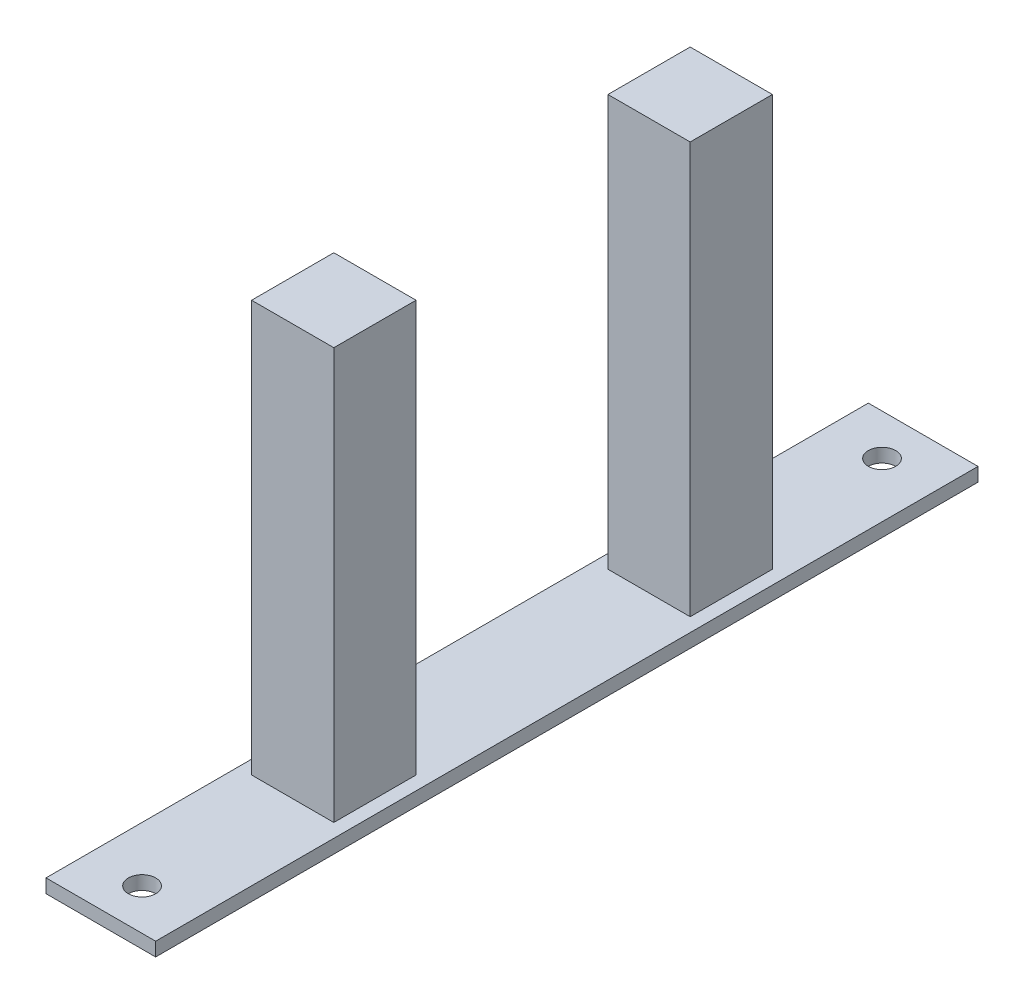
ISO-10303-21;
HEADER;
FILE_DESCRIPTION(('STEP AP214'),'2;1');
FILE_NAME('part.step','',(''),(''),'','','');
FILE_SCHEMA(('AUTOMOTIVE_DESIGN { 1 0 10303 214 1 1 1 1 }'));
ENDSEC;
DATA;
#1=APPLICATION_CONTEXT('core data for automotive mechanical design processes');
#2=APPLICATION_PROTOCOL_DEFINITION('international standard','automotive_design',2000,#1);
#3=PRODUCT_CONTEXT('',#1,'mechanical');
#4=PRODUCT('Part','Part','',(#3));
#5=PRODUCT_RELATED_PRODUCT_CATEGORY('part','',(#4));
#6=PRODUCT_DEFINITION_FORMATION('','',#4);
#7=PRODUCT_DEFINITION_CONTEXT('part definition',#1,'design');
#8=PRODUCT_DEFINITION('design','',#6,#7);
#9=PRODUCT_DEFINITION_SHAPE('','',#8);
#10=(LENGTH_UNIT() NAMED_UNIT(*) SI_UNIT(.MILLI.,.METRE.));
#11=(NAMED_UNIT(*) PLANE_ANGLE_UNIT() SI_UNIT($,.RADIAN.));
#12=(NAMED_UNIT(*) SI_UNIT($,.STERADIAN.) SOLID_ANGLE_UNIT());
#13=UNCERTAINTY_MEASURE_WITH_UNIT(LENGTH_MEASURE(1.E-05),#10,'distance_accuracy_value','');
#14=(GEOMETRIC_REPRESENTATION_CONTEXT(3) GLOBAL_UNCERTAINTY_ASSIGNED_CONTEXT((#13)) GLOBAL_UNIT_ASSIGNED_CONTEXT((#10,
#11,#12)) REPRESENTATION_CONTEXT('',''));
#15=CARTESIAN_POINT('',(0.,0.,0.));
#16=DIRECTION('',(0.,0.,1.));
#17=DIRECTION('',(1.,0.,0.));
#18=AXIS2_PLACEMENT_3D('',#15,#16,#17);
#19=CARTESIAN_POINT('',(0.,4.99999999999999,0.));
#20=DIRECTION('',(0.,1.,0.));
#21=DIRECTION('',(0.,0.,1.));
#22=AXIS2_PLACEMENT_3D('',#19,#20,#21);
#23=PLANE('',#22);
#24=CARTESIAN_POINT('',(0.0361864276667359,4.99999999999999,135.));
#25=DIRECTION('',(0.,1.,0.));
#26=DIRECTION('',(0.,0.,1.));
#27=AXIS2_PLACEMENT_3D('',#24,#25,#26);
#28=CIRCLE('',#27,5.);
#29=CARTESIAN_POINT('',(0.0361864276667359,4.99999999999999,140.));
#30=VERTEX_POINT('',#29);
#31=EDGE_CURVE('E437',#30,#30,#28,.T.);
#32=ORIENTED_EDGE('',*,*,#31,.F.);
#33=EDGE_LOOP('',(#32));
#34=FACE_BOUND('',#33,.T.);
#35=CARTESIAN_POINT('',(-0.0227474622545576,4.99999999999999,-135.));
#36=DIRECTION('',(0.,1.,0.));
#37=DIRECTION('',(0.,0.,1.));
#38=AXIS2_PLACEMENT_3D('',#35,#36,#37);
#39=CIRCLE('',#38,5.);
#40=CARTESIAN_POINT('',(-0.0227474622545576,4.99999999999999,-130.));
#41=VERTEX_POINT('',#40);
#42=EDGE_CURVE('E439',#41,#41,#39,.T.);
#43=ORIENTED_EDGE('',*,*,#42,.F.);
#44=EDGE_LOOP('',(#43));
#45=FACE_BOUND('',#44,.T.);
#46=DIRECTION('',(0.,0.,-1.));
#47=VECTOR('',#46,1.);
#48=CARTESIAN_POINT('',(20.,4.99999999999999,-150.));
#49=LINE('',#48,#47);
#50=CARTESIAN_POINT('',(20.,4.99999999999999,150.));
#51=VERTEX_POINT('',#50);
#52=CARTESIAN_POINT('',(20.,4.99999999999999,-150.));
#53=VERTEX_POINT('',#52);
#54=EDGE_CURVE('E187',#51,#53,#49,.T.);
#55=ORIENTED_EDGE('',*,*,#54,.T.);
#56=DIRECTION('',(-1.,0.,0.));
#57=VECTOR('',#56,1.);
#58=CARTESIAN_POINT('',(-20.,4.99999999999999,-150.));
#59=LINE('',#58,#57);
#60=CARTESIAN_POINT('',(-20.,4.99999999999999,-150.));
#61=VERTEX_POINT('',#60);
#62=EDGE_CURVE('E190',#53,#61,#59,.T.);
#63=ORIENTED_EDGE('',*,*,#62,.T.);
#64=DIRECTION('',(0.,0.,1.));
#65=VECTOR('',#64,1.);
#66=CARTESIAN_POINT('',(-20.,4.99999999999999,-150.));
#67=LINE('',#66,#65);
#68=CARTESIAN_POINT('',(-20.,4.99999999999999,150.));
#69=VERTEX_POINT('',#68);
#70=EDGE_CURVE('E193',#61,#69,#67,.T.);
#71=ORIENTED_EDGE('',*,*,#70,.T.);
#72=DIRECTION('',(1.,0.,0.));
#73=VECTOR('',#72,1.);
#74=CARTESIAN_POINT('',(-20.,4.99999999999999,150.));
#75=LINE('',#74,#73);
#76=EDGE_CURVE('E195',#69,#51,#75,.T.);
#77=ORIENTED_EDGE('',*,*,#76,.T.);
#78=EDGE_LOOP('',(#55,#63,#71,#77));
#79=FACE_BOUND('',#78,.T.);
#80=DIRECTION('',(-1.,0.,0.));
#81=VECTOR('',#80,1.);
#82=CARTESIAN_POINT('',(-15.,4.99999999999999,-80.));
#83=LINE('',#82,#81);
#84=CARTESIAN_POINT('',(15.,4.99999999999999,-80.));
#85=VERTEX_POINT('',#84);
#86=CARTESIAN_POINT('',(-15.,4.99999999999999,-80.));
#87=VERTEX_POINT('',#86);
#88=EDGE_CURVE('E152',#85,#87,#83,.T.);
#89=ORIENTED_EDGE('',*,*,#88,.F.);
#90=DIRECTION('',(0.,0.,-1.));
#91=VECTOR('',#90,1.);
#92=CARTESIAN_POINT('',(15.,4.99999999999999,-80.));
#93=LINE('',#92,#91);
#94=CARTESIAN_POINT('',(15.,4.99999999999999,-50.));
#95=VERTEX_POINT('',#94);
#96=EDGE_CURVE('E149',#95,#85,#93,.T.);
#97=ORIENTED_EDGE('',*,*,#96,.F.);
#98=DIRECTION('',(1.,0.,0.));
#99=VECTOR('',#98,1.);
#100=CARTESIAN_POINT('',(-15.,4.99999999999999,-50.));
#101=LINE('',#100,#99);
#102=CARTESIAN_POINT('',(-15.,4.99999999999999,-50.));
#103=VERTEX_POINT('',#102);
#104=EDGE_CURVE('E167',#103,#95,#101,.T.);
#105=ORIENTED_EDGE('',*,*,#104,.F.);
#106=DIRECTION('',(0.,0.,1.));
#107=VECTOR('',#106,1.);
#108=CARTESIAN_POINT('',(-15.,4.99999999999999,-80.));
#109=LINE('',#108,#107);
#110=EDGE_CURVE('E175',#87,#103,#109,.T.);
#111=ORIENTED_EDGE('',*,*,#110,.F.);
#112=EDGE_LOOP('',(#89,#97,#105,#111));
#113=FACE_BOUND('',#112,.T.);
#114=DIRECTION('',(-1.,0.,0.));
#115=VECTOR('',#114,1.);
#116=CARTESIAN_POINT('',(-15.,4.99999999999999,50.));
#117=LINE('',#116,#115);
#118=CARTESIAN_POINT('',(15.,4.99999999999999,49.9999999999999));
#119=VERTEX_POINT('',#118);
#120=CARTESIAN_POINT('',(-15.,4.99999999999999,50.));
#121=VERTEX_POINT('',#120);
#122=EDGE_CURVE('E148',#119,#121,#117,.T.);
#123=ORIENTED_EDGE('',*,*,#122,.F.);
#124=DIRECTION('',(0.,0.,-1.));
#125=VECTOR('',#124,1.);
#126=CARTESIAN_POINT('',(15.,4.99999999999999,49.9999999999999));
#127=LINE('',#126,#125);
#128=CARTESIAN_POINT('',(15.,4.99999999999999,80.));
#129=VERTEX_POINT('',#128);
#130=EDGE_CURVE('E143',#129,#119,#127,.T.);
#131=ORIENTED_EDGE('',*,*,#130,.F.);
#132=DIRECTION('',(1.,0.,0.));
#133=VECTOR('',#132,1.);
#134=CARTESIAN_POINT('',(-15.,4.99999999999999,80.));
#135=LINE('',#134,#133);
#136=CARTESIAN_POINT('',(-15.,4.99999999999999,80.));
#137=VERTEX_POINT('',#136);
#138=EDGE_CURVE('E128',#137,#129,#135,.T.);
#139=ORIENTED_EDGE('',*,*,#138,.F.);
#140=DIRECTION('',(0.,0.,1.));
#141=VECTOR('',#140,1.);
#142=CARTESIAN_POINT('',(-15.,4.99999999999999,50.));
#143=LINE('',#142,#141);
#144=EDGE_CURVE('E136',#121,#137,#143,.T.);
#145=ORIENTED_EDGE('',*,*,#144,.F.);
#146=EDGE_LOOP('',(#123,#131,#139,#145));
#147=FACE_BOUND('',#146,.T.);
#148=ADVANCED_FACE('F38',(#34,#45,#79,#113,#147),#23,.T.);
#149=CARTESIAN_POINT('',(20.,4.99999999999999,-150.));
#150=DIRECTION('',(-1.,0.,0.));
#151=DIRECTION('',(0.,0.,1.));
#152=AXIS2_PLACEMENT_3D('',#149,#150,#151);
#153=PLANE('',#152);
#154=DIRECTION('',(0.,0.,-1.));
#155=VECTOR('',#154,1.);
#156=CARTESIAN_POINT('',(20.,0.,-150.));
#157=LINE('',#156,#155);
#158=CARTESIAN_POINT('',(20.,0.,150.));
#159=VERTEX_POINT('',#158);
#160=CARTESIAN_POINT('',(20.,0.,-150.));
#161=VERTEX_POINT('',#160);
#162=EDGE_CURVE('E186',#159,#161,#157,.T.);
#163=ORIENTED_EDGE('',*,*,#162,.T.);
#164=DIRECTION('',(0.,-1.,0.));
#165=VECTOR('',#164,1.);
#166=CARTESIAN_POINT('',(20.,4.99999999999999,-150.));
#167=LINE('',#166,#165);
#168=EDGE_CURVE('E11',#53,#161,#167,.T.);
#169=ORIENTED_EDGE('',*,*,#168,.F.);
#170=ORIENTED_EDGE('',*,*,#54,.F.);
#171=DIRECTION('',(0.,-1.,0.));
#172=VECTOR('',#171,1.);
#173=CARTESIAN_POINT('',(20.,4.99999999999999,150.));
#174=LINE('',#173,#172);
#175=EDGE_CURVE('E197',#51,#159,#174,.T.);
#176=ORIENTED_EDGE('',*,*,#175,.T.);
#177=EDGE_LOOP('',(#163,#169,#170,#176));
#178=FACE_BOUND('',#177,.T.);
#179=ADVANCED_FACE('F40',(#178),#153,.F.);
#180=CARTESIAN_POINT('',(-20.,4.99999999999999,-150.));
#181=DIRECTION('',(0.,0.,1.));
#182=DIRECTION('',(1.,0.,0.));
#183=AXIS2_PLACEMENT_3D('',#180,#181,#182);
#184=PLANE('',#183);
#185=DIRECTION('',(-1.,0.,0.));
#186=VECTOR('',#185,1.);
#187=CARTESIAN_POINT('',(-20.,0.,-150.));
#188=LINE('',#187,#186);
#189=CARTESIAN_POINT('',(-20.,0.,-150.));
#190=VERTEX_POINT('',#189);
#191=EDGE_CURVE('E200',#161,#190,#188,.T.);
#192=ORIENTED_EDGE('',*,*,#191,.T.);
#193=DIRECTION('',(0.,-1.,0.));
#194=VECTOR('',#193,1.);
#195=CARTESIAN_POINT('',(-20.,4.99999999999999,-150.));
#196=LINE('',#195,#194);
#197=EDGE_CURVE('E46',#61,#190,#196,.T.);
#198=ORIENTED_EDGE('',*,*,#197,.F.);
#199=ORIENTED_EDGE('',*,*,#62,.F.);
#200=ORIENTED_EDGE('',*,*,#168,.T.);
#201=EDGE_LOOP('',(#192,#198,#199,#200));
#202=FACE_BOUND('',#201,.T.);
#203=ADVANCED_FACE('F230',(#202),#184,.F.);
#204=CARTESIAN_POINT('',(-20.,4.99999999999999,-150.));
#205=DIRECTION('',(1.,0.,0.));
#206=DIRECTION('',(0.,0.,-1.));
#207=AXIS2_PLACEMENT_3D('',#204,#205,#206);
#208=PLANE('',#207);
#209=DIRECTION('',(0.,0.,1.));
#210=VECTOR('',#209,1.);
#211=CARTESIAN_POINT('',(-20.,0.,-150.));
#212=LINE('',#211,#210);
#213=CARTESIAN_POINT('',(-20.,0.,150.));
#214=VERTEX_POINT('',#213);
#215=EDGE_CURVE('E202',#190,#214,#212,.T.);
#216=ORIENTED_EDGE('',*,*,#215,.T.);
#217=DIRECTION('',(0.,-1.,0.));
#218=VECTOR('',#217,1.);
#219=CARTESIAN_POINT('',(-20.,4.99999999999999,150.));
#220=LINE('',#219,#218);
#221=EDGE_CURVE('E207',#69,#214,#220,.T.);
#222=ORIENTED_EDGE('',*,*,#221,.F.);
#223=ORIENTED_EDGE('',*,*,#70,.F.);
#224=ORIENTED_EDGE('',*,*,#197,.T.);
#225=EDGE_LOOP('',(#216,#222,#223,#224));
#226=FACE_BOUND('',#225,.T.);
#227=ADVANCED_FACE('F214',(#226),#208,.F.);
#228=CARTESIAN_POINT('',(-20.,4.99999999999999,150.));
#229=DIRECTION('',(0.,0.,-1.));
#230=DIRECTION('',(-1.,0.,0.));
#231=AXIS2_PLACEMENT_3D('',#228,#229,#230);
#232=PLANE('',#231);
#233=DIRECTION('',(1.,0.,0.));
#234=VECTOR('',#233,1.);
#235=CARTESIAN_POINT('',(-20.,0.,150.));
#236=LINE('',#235,#234);
#237=EDGE_CURVE('E191',#214,#159,#236,.T.);
#238=ORIENTED_EDGE('',*,*,#237,.T.);
#239=ORIENTED_EDGE('',*,*,#175,.F.);
#240=ORIENTED_EDGE('',*,*,#76,.F.);
#241=ORIENTED_EDGE('',*,*,#221,.T.);
#242=EDGE_LOOP('',(#238,#239,#240,#241));
#243=FACE_BOUND('',#242,.T.);
#244=ADVANCED_FACE('F223',(#243),#232,.F.);
#245=CARTESIAN_POINT('',(0.,0.,0.));
#246=DIRECTION('',(0.,1.,0.));
#247=DIRECTION('',(0.,0.,1.));
#248=AXIS2_PLACEMENT_3D('',#245,#246,#247);
#249=PLANE('',#248);
#250=CARTESIAN_POINT('',(0.0361864276667359,0.,135.));
#251=DIRECTION('',(0.,1.,0.));
#252=DIRECTION('',(0.,0.,1.));
#253=AXIS2_PLACEMENT_3D('',#250,#251,#252);
#254=CIRCLE('',#253,5.);
#255=CARTESIAN_POINT('',(0.0361864276667359,0.,140.));
#256=VERTEX_POINT('',#255);
#257=EDGE_CURVE('E435',#256,#256,#254,.T.);
#258=ORIENTED_EDGE('',*,*,#257,.T.);
#259=EDGE_LOOP('',(#258));
#260=FACE_BOUND('',#259,.T.);
#261=CARTESIAN_POINT('',(-0.0227474622545576,0.,-135.));
#262=DIRECTION('',(0.,1.,0.));
#263=DIRECTION('',(0.,0.,1.));
#264=AXIS2_PLACEMENT_3D('',#261,#262,#263);
#265=CIRCLE('',#264,5.);
#266=CARTESIAN_POINT('',(-0.0227474622545576,0.,-130.));
#267=VERTEX_POINT('',#266);
#268=EDGE_CURVE('E442',#267,#267,#265,.T.);
#269=ORIENTED_EDGE('',*,*,#268,.T.);
#270=EDGE_LOOP('',(#269));
#271=FACE_BOUND('',#270,.T.);
#272=ORIENTED_EDGE('',*,*,#162,.F.);
#273=ORIENTED_EDGE('',*,*,#237,.F.);
#274=ORIENTED_EDGE('',*,*,#215,.F.);
#275=ORIENTED_EDGE('',*,*,#191,.F.);
#276=EDGE_LOOP('',(#272,#273,#274,#275));
#277=FACE_BOUND('',#276,.T.);
#278=ADVANCED_FACE('F220',(#260,#271,#277),#249,.F.);
#279=CARTESIAN_POINT('',(15.,155.,-80.));
#280=DIRECTION('',(-1.,0.,0.));
#281=DIRECTION('',(0.,0.,1.));
#282=AXIS2_PLACEMENT_3D('',#279,#280,#281);
#283=PLANE('',#282);
#284=ORIENTED_EDGE('',*,*,#96,.T.);
#285=DIRECTION('',(0.,-1.,0.));
#286=VECTOR('',#285,1.);
#287=CARTESIAN_POINT('',(15.,155.,-80.));
#288=LINE('',#287,#286);
#289=CARTESIAN_POINT('',(15.,155.,-80.));
#290=VERTEX_POINT('',#289);
#291=EDGE_CURVE('E184',#290,#85,#288,.T.);
#292=ORIENTED_EDGE('',*,*,#291,.F.);
#293=DIRECTION('',(0.,0.,-1.));
#294=VECTOR('',#293,1.);
#295=CARTESIAN_POINT('',(15.,155.,-80.));
#296=LINE('',#295,#294);
#297=CARTESIAN_POINT('',(15.,155.,-50.));
#298=VERTEX_POINT('',#297);
#299=EDGE_CURVE('E163',#298,#290,#296,.T.);
#300=ORIENTED_EDGE('',*,*,#299,.F.);
#301=DIRECTION('',(0.,-1.,0.));
#302=VECTOR('',#301,1.);
#303=CARTESIAN_POINT('',(15.,155.,-50.));
#304=LINE('',#303,#302);
#305=EDGE_CURVE('E172',#298,#95,#304,.T.);
#306=ORIENTED_EDGE('',*,*,#305,.T.);
#307=EDGE_LOOP('',(#284,#292,#300,#306));
#308=FACE_BOUND('',#307,.T.);
#309=ADVANCED_FACE('F246',(#308),#283,.F.);
#310=CARTESIAN_POINT('',(-15.,155.,-80.));
#311=DIRECTION('',(0.,0.,1.));
#312=DIRECTION('',(1.,0.,0.));
#313=AXIS2_PLACEMENT_3D('',#310,#311,#312);
#314=PLANE('',#313);
#315=ORIENTED_EDGE('',*,*,#88,.T.);
#316=DIRECTION('',(0.,-1.,0.));
#317=VECTOR('',#316,1.);
#318=CARTESIAN_POINT('',(-15.,155.,-80.));
#319=LINE('',#318,#317);
#320=CARTESIAN_POINT('',(-15.,155.,-80.));
#321=VERTEX_POINT('',#320);
#322=EDGE_CURVE('E181',#321,#87,#319,.T.);
#323=ORIENTED_EDGE('',*,*,#322,.F.);
#324=DIRECTION('',(-1.,0.,0.));
#325=VECTOR('',#324,1.);
#326=CARTESIAN_POINT('',(-15.,155.,-80.));
#327=LINE('',#326,#325);
#328=EDGE_CURVE('E166',#290,#321,#327,.T.);
#329=ORIENTED_EDGE('',*,*,#328,.F.);
#330=ORIENTED_EDGE('',*,*,#291,.T.);
#331=EDGE_LOOP('',(#315,#323,#329,#330));
#332=FACE_BOUND('',#331,.T.);
#333=ADVANCED_FACE('F267',(#332),#314,.F.);
#334=CARTESIAN_POINT('',(-15.,155.,-80.));
#335=DIRECTION('',(1.,0.,0.));
#336=DIRECTION('',(0.,0.,-1.));
#337=AXIS2_PLACEMENT_3D('',#334,#335,#336);
#338=PLANE('',#337);
#339=ORIENTED_EDGE('',*,*,#110,.T.);
#340=DIRECTION('',(0.,-1.,0.));
#341=VECTOR('',#340,1.);
#342=CARTESIAN_POINT('',(-15.,155.,-50.));
#343=LINE('',#342,#341);
#344=CARTESIAN_POINT('',(-15.,155.,-50.));
#345=VERTEX_POINT('',#344);
#346=EDGE_CURVE('E61',#345,#103,#343,.T.);
#347=ORIENTED_EDGE('',*,*,#346,.F.);
#348=DIRECTION('',(0.,0.,1.));
#349=VECTOR('',#348,1.);
#350=CARTESIAN_POINT('',(-15.,155.,-80.));
#351=LINE('',#350,#349);
#352=EDGE_CURVE('E169',#321,#345,#351,.T.);
#353=ORIENTED_EDGE('',*,*,#352,.F.);
#354=ORIENTED_EDGE('',*,*,#322,.T.);
#355=EDGE_LOOP('',(#339,#347,#353,#354));
#356=FACE_BOUND('',#355,.T.);
#357=ADVANCED_FACE('F274',(#356),#338,.F.);
#358=CARTESIAN_POINT('',(-15.,155.,-50.));
#359=DIRECTION('',(0.,0.,-1.));
#360=DIRECTION('',(-1.,0.,0.));
#361=AXIS2_PLACEMENT_3D('',#358,#359,#360);
#362=PLANE('',#361);
#363=ORIENTED_EDGE('',*,*,#104,.T.);
#364=ORIENTED_EDGE('',*,*,#305,.F.);
#365=DIRECTION('',(1.,0.,0.));
#366=VECTOR('',#365,1.);
#367=CARTESIAN_POINT('',(-15.,155.,-50.));
#368=LINE('',#367,#366);
#369=EDGE_CURVE('E171',#345,#298,#368,.T.);
#370=ORIENTED_EDGE('',*,*,#369,.F.);
#371=ORIENTED_EDGE('',*,*,#346,.T.);
#372=EDGE_LOOP('',(#363,#364,#370,#371));
#373=FACE_BOUND('',#372,.T.);
#374=ADVANCED_FACE('F281',(#373),#362,.F.);
#375=CARTESIAN_POINT('',(0.,155.,0.));
#376=DIRECTION('',(0.,1.,0.));
#377=DIRECTION('',(0.,0.,1.));
#378=AXIS2_PLACEMENT_3D('',#375,#376,#377);
#379=PLANE('',#378);
#380=ORIENTED_EDGE('',*,*,#299,.T.);
#381=ORIENTED_EDGE('',*,*,#328,.T.);
#382=ORIENTED_EDGE('',*,*,#352,.T.);
#383=ORIENTED_EDGE('',*,*,#369,.T.);
#384=EDGE_LOOP('',(#380,#381,#382,#383));
#385=FACE_BOUND('',#384,.T.);
#386=ADVANCED_FACE('F289',(#385),#379,.T.);
#387=CARTESIAN_POINT('',(15.,155.,49.9999999999999));
#388=DIRECTION('',(-1.,0.,0.));
#389=DIRECTION('',(0.,0.,1.));
#390=AXIS2_PLACEMENT_3D('',#387,#388,#389);
#391=PLANE('',#390);
#392=ORIENTED_EDGE('',*,*,#130,.T.);
#393=DIRECTION('',(0.,-1.,0.));
#394=VECTOR('',#393,1.);
#395=CARTESIAN_POINT('',(15.,155.,49.9999999999999));
#396=LINE('',#395,#394);
#397=CARTESIAN_POINT('',(15.,155.,49.9999999999999));
#398=VERTEX_POINT('',#397);
#399=EDGE_CURVE('E445',#398,#119,#396,.T.);
#400=ORIENTED_EDGE('',*,*,#399,.F.);
#401=DIRECTION('',(0.,0.,-1.));
#402=VECTOR('',#401,1.);
#403=CARTESIAN_POINT('',(15.,155.,49.9999999999999));
#404=LINE('',#403,#402);
#405=CARTESIAN_POINT('',(15.,155.,80.));
#406=VERTEX_POINT('',#405);
#407=EDGE_CURVE('E137',#406,#398,#404,.T.);
#408=ORIENTED_EDGE('',*,*,#407,.F.);
#409=DIRECTION('',(0.,-1.,0.));
#410=VECTOR('',#409,1.);
#411=CARTESIAN_POINT('',(15.,155.,80.));
#412=LINE('',#411,#410);
#413=EDGE_CURVE('E131',#406,#129,#412,.T.);
#414=ORIENTED_EDGE('',*,*,#413,.T.);
#415=EDGE_LOOP('',(#392,#400,#408,#414));
#416=FACE_BOUND('',#415,.T.);
#417=ADVANCED_FACE('F141',(#416),#391,.F.);
#418=CARTESIAN_POINT('',(-15.,155.,50.));
#419=DIRECTION('',(0.,0.,1.));
#420=DIRECTION('',(1.,0.,0.));
#421=AXIS2_PLACEMENT_3D('',#418,#419,#420);
#422=PLANE('',#421);
#423=ORIENTED_EDGE('',*,*,#122,.T.);
#424=DIRECTION('',(0.,-1.,0.));
#425=VECTOR('',#424,1.);
#426=CARTESIAN_POINT('',(-15.,155.,50.));
#427=LINE('',#426,#425);
#428=CARTESIAN_POINT('',(-15.,155.,50.));
#429=VERTEX_POINT('',#428);
#430=EDGE_CURVE('E449',#429,#121,#427,.T.);
#431=ORIENTED_EDGE('',*,*,#430,.F.);
#432=DIRECTION('',(-1.,0.,0.));
#433=VECTOR('',#432,1.);
#434=CARTESIAN_POINT('',(-15.,155.,50.));
#435=LINE('',#434,#433);
#436=EDGE_CURVE('E160',#398,#429,#435,.T.);
#437=ORIENTED_EDGE('',*,*,#436,.F.);
#438=ORIENTED_EDGE('',*,*,#399,.T.);
#439=EDGE_LOOP('',(#423,#431,#437,#438));
#440=FACE_BOUND('',#439,.T.);
#441=ADVANCED_FACE('F303',(#440),#422,.F.);
#442=CARTESIAN_POINT('',(-15.,155.,50.));
#443=DIRECTION('',(1.,0.,0.));
#444=DIRECTION('',(0.,0.,-1.));
#445=AXIS2_PLACEMENT_3D('',#442,#443,#444);
#446=PLANE('',#445);
#447=ORIENTED_EDGE('',*,*,#144,.T.);
#448=DIRECTION('',(0.,-1.,0.));
#449=VECTOR('',#448,1.);
#450=CARTESIAN_POINT('',(-15.,155.,80.));
#451=LINE('',#450,#449);
#452=CARTESIAN_POINT('',(-15.,155.,80.));
#453=VERTEX_POINT('',#452);
#454=EDGE_CURVE('E53',#453,#137,#451,.T.);
#455=ORIENTED_EDGE('',*,*,#454,.F.);
#456=DIRECTION('',(0.,0.,1.));
#457=VECTOR('',#456,1.);
#458=CARTESIAN_POINT('',(-15.,155.,50.));
#459=LINE('',#458,#457);
#460=EDGE_CURVE('E158',#429,#453,#459,.T.);
#461=ORIENTED_EDGE('',*,*,#460,.F.);
#462=ORIENTED_EDGE('',*,*,#430,.T.);
#463=EDGE_LOOP('',(#447,#455,#461,#462));
#464=FACE_BOUND('',#463,.T.);
#465=ADVANCED_FACE('F310',(#464),#446,.F.);
#466=CARTESIAN_POINT('',(-15.,155.,80.));
#467=DIRECTION('',(0.,0.,-1.));
#468=DIRECTION('',(-1.,0.,0.));
#469=AXIS2_PLACEMENT_3D('',#466,#467,#468);
#470=PLANE('',#469);
#471=ORIENTED_EDGE('',*,*,#138,.T.);
#472=ORIENTED_EDGE('',*,*,#413,.F.);
#473=DIRECTION('',(1.,0.,0.));
#474=VECTOR('',#473,1.);
#475=CARTESIAN_POINT('',(-15.,155.,80.));
#476=LINE('',#475,#474);
#477=EDGE_CURVE('E146',#453,#406,#476,.T.);
#478=ORIENTED_EDGE('',*,*,#477,.F.);
#479=ORIENTED_EDGE('',*,*,#454,.T.);
#480=EDGE_LOOP('',(#471,#472,#478,#479));
#481=FACE_BOUND('',#480,.T.);
#482=ADVANCED_FACE('F130',(#481),#470,.F.);
#483=CARTESIAN_POINT('',(0.,155.,0.));
#484=DIRECTION('',(0.,1.,0.));
#485=DIRECTION('',(0.,0.,1.));
#486=AXIS2_PLACEMENT_3D('',#483,#484,#485);
#487=PLANE('',#486);
#488=ORIENTED_EDGE('',*,*,#407,.T.);
#489=ORIENTED_EDGE('',*,*,#436,.T.);
#490=ORIENTED_EDGE('',*,*,#460,.T.);
#491=ORIENTED_EDGE('',*,*,#477,.T.);
#492=EDGE_LOOP('',(#488,#489,#490,#491));
#493=FACE_BOUND('',#492,.T.);
#494=ADVANCED_FACE('F325',(#493),#487,.T.);
#495=CARTESIAN_POINT('',(-0.0227474622545576,0.,-135.));
#496=DIRECTION('',(0.,1.,0.));
#497=DIRECTION('',(0.,0.,1.));
#498=AXIS2_PLACEMENT_3D('',#495,#496,#497);
#499=CYLINDRICAL_SURFACE('',#498,5.);
#500=ORIENTED_EDGE('',*,*,#268,.F.);
#501=EDGE_LOOP('',(#500));
#502=FACE_BOUND('',#501,.T.);
#503=ORIENTED_EDGE('',*,*,#42,.T.);
#504=EDGE_LOOP('',(#503));
#505=FACE_BOUND('',#504,.T.);
#506=ADVANCED_FACE('F332',(#502,#505),#499,.F.);
#507=CARTESIAN_POINT('',(0.0361864276667359,0.,135.));
#508=DIRECTION('',(0.,1.,0.));
#509=DIRECTION('',(0.,0.,1.));
#510=AXIS2_PLACEMENT_3D('',#507,#508,#509);
#511=CYLINDRICAL_SURFACE('',#510,5.);
#512=ORIENTED_EDGE('',*,*,#257,.F.);
#513=EDGE_LOOP('',(#512));
#514=FACE_BOUND('',#513,.T.);
#515=ORIENTED_EDGE('',*,*,#31,.T.);
#516=EDGE_LOOP('',(#515));
#517=FACE_BOUND('',#516,.T.);
#518=ADVANCED_FACE('F340',(#514,#517),#511,.F.);
#519=CLOSED_SHELL('',(#148,#179,#203,#227,#244,#278,#309,#333,#357,#374,#386,#417,#441,#465,
#482,#494,#506,#518));
#520=MANIFOLD_SOLID_BREP('B2',#519);
#521=ADVANCED_BREP_SHAPE_REPRESENTATION('',(#18,#520),#14);
#522=SHAPE_DEFINITION_REPRESENTATION(#9,#521);
ENDSEC;
END-ISO-10303-21;
